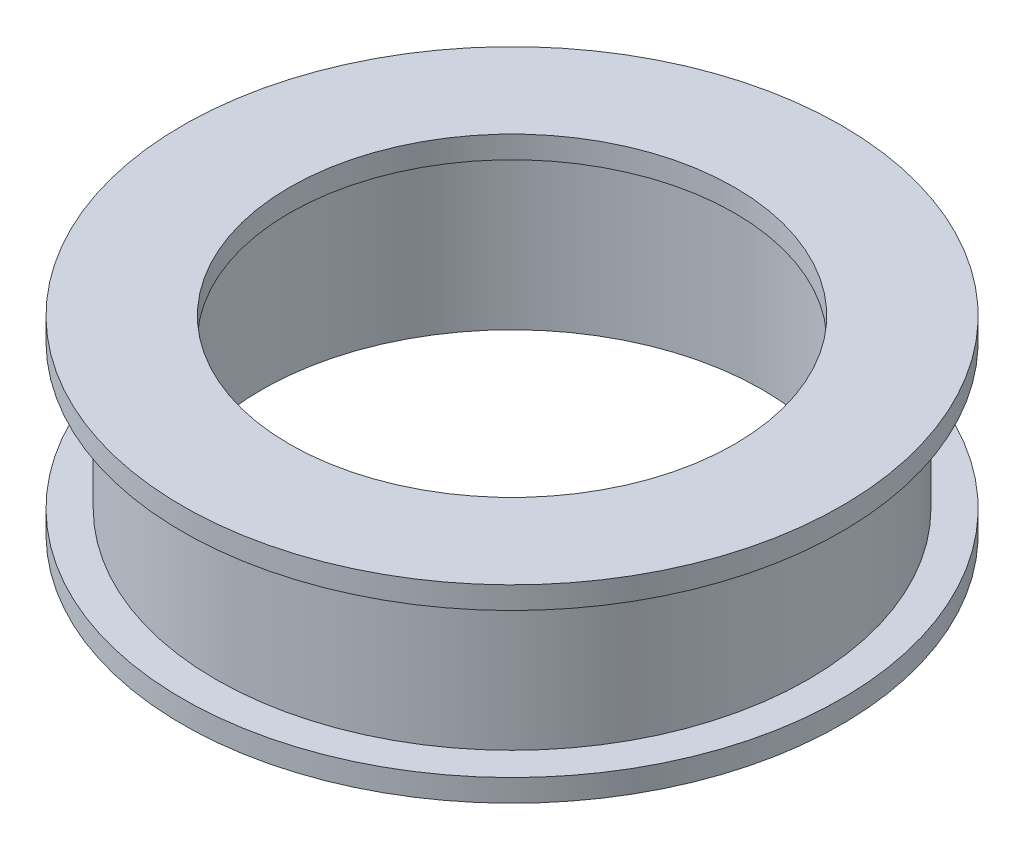
ISO-10303-21;
HEADER;
FILE_DESCRIPTION(('STEP AP214'),'2;1');
FILE_NAME('part.step','',(''),(''),'','','');
FILE_SCHEMA(('AUTOMOTIVE_DESIGN { 1 0 10303 214 1 1 1 1 }'));
ENDSEC;
DATA;
#1=APPLICATION_CONTEXT('core data for automotive mechanical design processes');
#2=APPLICATION_PROTOCOL_DEFINITION('international standard','automotive_design',2000,#1);
#3=PRODUCT_CONTEXT('',#1,'mechanical');
#4=PRODUCT('Part','Part','',(#3));
#5=PRODUCT_RELATED_PRODUCT_CATEGORY('part','',(#4));
#6=PRODUCT_DEFINITION_FORMATION('','',#4);
#7=PRODUCT_DEFINITION_CONTEXT('part definition',#1,'design');
#8=PRODUCT_DEFINITION('design','',#6,#7);
#9=PRODUCT_DEFINITION_SHAPE('','',#8);
#10=(LENGTH_UNIT() NAMED_UNIT(*) SI_UNIT(.MILLI.,.METRE.));
#11=(NAMED_UNIT(*) PLANE_ANGLE_UNIT() SI_UNIT($,.RADIAN.));
#12=(NAMED_UNIT(*) SI_UNIT($,.STERADIAN.) SOLID_ANGLE_UNIT());
#13=UNCERTAINTY_MEASURE_WITH_UNIT(LENGTH_MEASURE(1.E-05),#10,'distance_accuracy_value','');
#14=(GEOMETRIC_REPRESENTATION_CONTEXT(3) GLOBAL_UNCERTAINTY_ASSIGNED_CONTEXT((#13)) GLOBAL_UNIT_ASSIGNED_CONTEXT((#10,
#11,#12)) REPRESENTATION_CONTEXT('',''));
#15=CARTESIAN_POINT('',(0.,0.,0.));
#16=DIRECTION('',(0.,0.,1.));
#17=DIRECTION('',(1.,0.,0.));
#18=AXIS2_PLACEMENT_3D('',#15,#16,#17);
#19=CARTESIAN_POINT('',(0.,0.,0.));
#20=DIRECTION('',(0.,-1.,0.));
#21=DIRECTION('',(0.,0.,-1.));
#22=AXIS2_PLACEMENT_3D('',#19,#20,#21);
#23=CYLINDRICAL_SURFACE('',#22,11.25);
#24=CARTESIAN_POINT('',(0.,7.5,0.));
#25=DIRECTION('',(0.,-1.,0.));
#26=DIRECTION('',(0.,0.,-1.));
#27=AXIS2_PLACEMENT_3D('',#24,#25,#26);
#28=CIRCLE('',#27,11.25);
#29=CARTESIAN_POINT('',(0.,7.5,-11.25));
#30=VERTEX_POINT('',#29);
#31=EDGE_CURVE('E65',#30,#30,#28,.T.);
#32=ORIENTED_EDGE('',*,*,#31,.F.);
#33=EDGE_LOOP('',(#32));
#34=FACE_BOUND('',#33,.T.);
#35=CARTESIAN_POINT('',(0.,0.,0.));
#36=DIRECTION('',(0.,-1.,0.));
#37=DIRECTION('',(0.,0.,-1.));
#38=AXIS2_PLACEMENT_3D('',#35,#36,#37);
#39=CIRCLE('',#38,11.25);
#40=CARTESIAN_POINT('',(0.,0.,-11.25));
#41=VERTEX_POINT('',#40);
#42=EDGE_CURVE('E10',#41,#41,#39,.T.);
#43=ORIENTED_EDGE('',*,*,#42,.T.);
#44=EDGE_LOOP('',(#43));
#45=FACE_BOUND('',#44,.T.);
#46=ADVANCED_FACE('F31',(#34,#45),#23,.F.);
#47=CARTESIAN_POINT('',(-11.25,0.,0.));
#48=DIRECTION('',(0.,1.,0.));
#49=DIRECTION('',(0.,0.,1.));
#50=AXIS2_PLACEMENT_3D('',#47,#48,#49);
#51=PLANE('',#50);
#52=ORIENTED_EDGE('',*,*,#42,.F.);
#53=EDGE_LOOP('',(#52));
#54=FACE_BOUND('',#53,.T.);
#55=CARTESIAN_POINT('',(0.,0.,0.));
#56=DIRECTION('',(0.,-1.,0.));
#57=DIRECTION('',(0.,0.,-1.));
#58=AXIS2_PLACEMENT_3D('',#55,#56,#57);
#59=CIRCLE('',#58,14.8106030064383);
#60=CARTESIAN_POINT('',(0.,0.,-14.8106030064383));
#61=VERTEX_POINT('',#60);
#62=EDGE_CURVE('E37',#61,#61,#59,.T.);
#63=ORIENTED_EDGE('',*,*,#62,.T.);
#64=EDGE_LOOP('',(#63));
#65=FACE_BOUND('',#64,.T.);
#66=ADVANCED_FACE('F72',(#54,#65),#51,.F.);
#67=CARTESIAN_POINT('',(0.,0.,0.));
#68=DIRECTION('',(0.,-1.,0.));
#69=DIRECTION('',(0.,0.,-1.));
#70=AXIS2_PLACEMENT_3D('',#67,#68,#69);
#71=CYLINDRICAL_SURFACE('',#70,14.8106030064383);
#72=ORIENTED_EDGE('',*,*,#62,.F.);
#73=EDGE_LOOP('',(#72));
#74=FACE_BOUND('',#73,.T.);
#75=CARTESIAN_POINT('',(0.,0.99999999999998,0.));
#76=DIRECTION('',(0.,-1.,0.));
#77=DIRECTION('',(0.,0.,-1.));
#78=AXIS2_PLACEMENT_3D('',#75,#76,#77);
#79=CIRCLE('',#78,14.8106030064383);
#80=CARTESIAN_POINT('',(0.,0.99999999999998,-14.8106030064383));
#81=VERTEX_POINT('',#80);
#82=EDGE_CURVE('E41',#81,#81,#79,.T.);
#83=ORIENTED_EDGE('',*,*,#82,.T.);
#84=EDGE_LOOP('',(#83));
#85=FACE_BOUND('',#84,.T.);
#86=ADVANCED_FACE('F76',(#74,#85),#71,.T.);
#87=CARTESIAN_POINT('',(-14.8106030064383,0.99999999999998,0.));
#88=DIRECTION('',(0.,-1.,0.));
#89=DIRECTION('',(0.,0.,-1.));
#90=AXIS2_PLACEMENT_3D('',#87,#88,#89);
#91=PLANE('',#90);
#92=ORIENTED_EDGE('',*,*,#82,.F.);
#93=EDGE_LOOP('',(#92));
#94=FACE_BOUND('',#93,.T.);
#95=CARTESIAN_POINT('',(0.,0.999999999999981,0.));
#96=DIRECTION('',(0.,-1.,0.));
#97=DIRECTION('',(0.,0.,-1.));
#98=AXIS2_PLACEMENT_3D('',#95,#96,#97);
#99=CIRCLE('',#98,13.3106030064383);
#100=CARTESIAN_POINT('',(0.,0.999999999999981,-13.3106030064383));
#101=VERTEX_POINT('',#100);
#102=EDGE_CURVE('E45',#101,#101,#99,.T.);
#103=ORIENTED_EDGE('',*,*,#102,.T.);
#104=EDGE_LOOP('',(#103));
#105=FACE_BOUND('',#104,.T.);
#106=ADVANCED_FACE('F81',(#94,#105),#91,.F.);
#107=CARTESIAN_POINT('',(0.,0.,0.));
#108=DIRECTION('',(0.,-1.,0.));
#109=DIRECTION('',(0.,0.,-1.));
#110=AXIS2_PLACEMENT_3D('',#107,#108,#109);
#111=CYLINDRICAL_SURFACE('',#110,13.3106030064383);
#112=ORIENTED_EDGE('',*,*,#102,.F.);
#113=EDGE_LOOP('',(#112));
#114=FACE_BOUND('',#113,.T.);
#115=CARTESIAN_POINT('',(0.,7.5,0.));
#116=DIRECTION('',(0.,-1.,0.));
#117=DIRECTION('',(0.,0.,-1.));
#118=AXIS2_PLACEMENT_3D('',#115,#116,#117);
#119=CIRCLE('',#118,13.3106030064383);
#120=CARTESIAN_POINT('',(0.,7.5,-13.3106030064383));
#121=VERTEX_POINT('',#120);
#122=EDGE_CURVE('E50',#121,#121,#119,.T.);
#123=ORIENTED_EDGE('',*,*,#122,.T.);
#124=EDGE_LOOP('',(#123));
#125=FACE_BOUND('',#124,.T.);
#126=ADVANCED_FACE('F87',(#114,#125),#111,.T.);
#127=CARTESIAN_POINT('',(-13.3106030064383,7.5,0.));
#128=DIRECTION('',(0.,1.,0.));
#129=DIRECTION('',(0.,0.,1.));
#130=AXIS2_PLACEMENT_3D('',#127,#128,#129);
#131=PLANE('',#130);
#132=ORIENTED_EDGE('',*,*,#122,.F.);
#133=EDGE_LOOP('',(#132));
#134=FACE_BOUND('',#133,.T.);
#135=CARTESIAN_POINT('',(0.,7.5,0.));
#136=DIRECTION('',(0.,-1.,0.));
#137=DIRECTION('',(0.,0.,-1.));
#138=AXIS2_PLACEMENT_3D('',#135,#136,#137);
#139=CIRCLE('',#138,14.8106030064383);
#140=CARTESIAN_POINT('',(0.,7.5,-14.8106030064383));
#141=VERTEX_POINT('',#140);
#142=EDGE_CURVE('E53',#141,#141,#139,.T.);
#143=ORIENTED_EDGE('',*,*,#142,.T.);
#144=EDGE_LOOP('',(#143));
#145=FACE_BOUND('',#144,.T.);
#146=ADVANCED_FACE('F91',(#134,#145),#131,.F.);
#147=CARTESIAN_POINT('',(0.,0.,0.));
#148=DIRECTION('',(0.,-1.,0.));
#149=DIRECTION('',(0.,0.,-1.));
#150=AXIS2_PLACEMENT_3D('',#147,#148,#149);
#151=CYLINDRICAL_SURFACE('',#150,14.8106030064383);
#152=ORIENTED_EDGE('',*,*,#142,.F.);
#153=EDGE_LOOP('',(#152));
#154=FACE_BOUND('',#153,.T.);
#155=CARTESIAN_POINT('',(0.,8.5,0.));
#156=DIRECTION('',(0.,-1.,0.));
#157=DIRECTION('',(0.,0.,-1.));
#158=AXIS2_PLACEMENT_3D('',#155,#156,#157);
#159=CIRCLE('',#158,14.8106030064383);
#160=CARTESIAN_POINT('',(0.,8.5,-14.8106030064383));
#161=VERTEX_POINT('',#160);
#162=EDGE_CURVE('E56',#161,#161,#159,.T.);
#163=ORIENTED_EDGE('',*,*,#162,.T.);
#164=EDGE_LOOP('',(#163));
#165=FACE_BOUND('',#164,.T.);
#166=ADVANCED_FACE('F95',(#154,#165),#151,.T.);
#167=CARTESIAN_POINT('',(-14.8106030064383,8.5,0.));
#168=DIRECTION('',(0.,-1.,0.));
#169=DIRECTION('',(0.,0.,-1.));
#170=AXIS2_PLACEMENT_3D('',#167,#168,#169);
#171=PLANE('',#170);
#172=ORIENTED_EDGE('',*,*,#162,.F.);
#173=EDGE_LOOP('',(#172));
#174=FACE_BOUND('',#173,.T.);
#175=CARTESIAN_POINT('',(0.,8.5,0.));
#176=DIRECTION('',(0.,-1.,0.));
#177=DIRECTION('',(0.,0.,-1.));
#178=AXIS2_PLACEMENT_3D('',#175,#176,#177);
#179=CIRCLE('',#178,10.);
#180=CARTESIAN_POINT('',(0.,8.5,-10.));
#181=VERTEX_POINT('',#180);
#182=EDGE_CURVE('E59',#181,#181,#179,.T.);
#183=ORIENTED_EDGE('',*,*,#182,.T.);
#184=EDGE_LOOP('',(#183));
#185=FACE_BOUND('',#184,.T.);
#186=ADVANCED_FACE('F99',(#174,#185),#171,.F.);
#187=CARTESIAN_POINT('',(0.,0.,0.));
#188=DIRECTION('',(0.,-1.,0.));
#189=DIRECTION('',(0.,0.,-1.));
#190=AXIS2_PLACEMENT_3D('',#187,#188,#189);
#191=CYLINDRICAL_SURFACE('',#190,10.);
#192=ORIENTED_EDGE('',*,*,#182,.F.);
#193=EDGE_LOOP('',(#192));
#194=FACE_BOUND('',#193,.T.);
#195=CARTESIAN_POINT('',(0.,7.5,0.));
#196=DIRECTION('',(0.,-1.,0.));
#197=DIRECTION('',(0.,0.,-1.));
#198=AXIS2_PLACEMENT_3D('',#195,#196,#197);
#199=CIRCLE('',#198,10.);
#200=CARTESIAN_POINT('',(0.,7.5,-10.));
#201=VERTEX_POINT('',#200);
#202=EDGE_CURVE('E62',#201,#201,#199,.T.);
#203=ORIENTED_EDGE('',*,*,#202,.T.);
#204=EDGE_LOOP('',(#203));
#205=FACE_BOUND('',#204,.T.);
#206=ADVANCED_FACE('F103',(#194,#205),#191,.F.);
#207=CARTESIAN_POINT('',(-10.,7.5,0.));
#208=DIRECTION('',(0.,1.,0.));
#209=DIRECTION('',(0.,0.,1.));
#210=AXIS2_PLACEMENT_3D('',#207,#208,#209);
#211=PLANE('',#210);
#212=ORIENTED_EDGE('',*,*,#202,.F.);
#213=EDGE_LOOP('',(#212));
#214=FACE_BOUND('',#213,.T.);
#215=ORIENTED_EDGE('',*,*,#31,.T.);
#216=EDGE_LOOP('',(#215));
#217=FACE_BOUND('',#216,.T.);
#218=ADVANCED_FACE('F69',(#214,#217),#211,.F.);
#219=CLOSED_SHELL('',(#46,#66,#86,#106,#126,#146,#166,#186,#206,#218));
#220=MANIFOLD_SOLID_BREP('B2',#219);
#221=ADVANCED_BREP_SHAPE_REPRESENTATION('',(#18,#220),#14);
#222=SHAPE_DEFINITION_REPRESENTATION(#9,#221);
ENDSEC;
END-ISO-10303-21;
